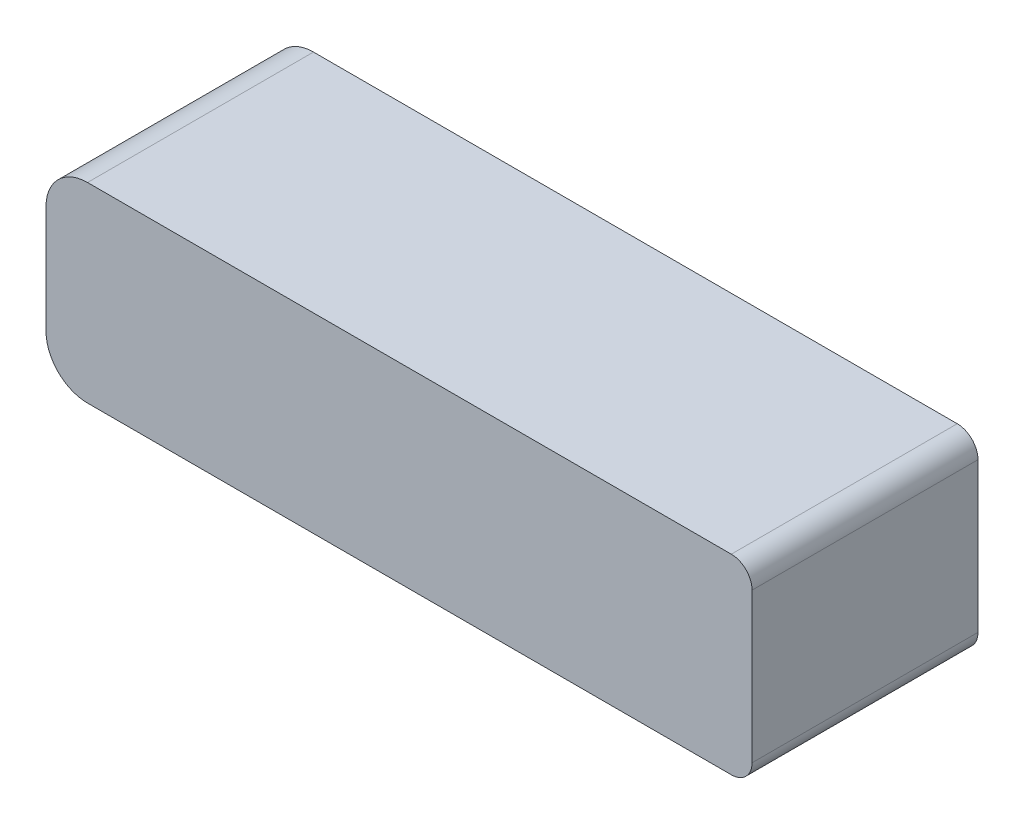
ISO-10303-21;
HEADER;
FILE_DESCRIPTION(('STEP AP214'),'2;1');
FILE_NAME('part.step','',(''),(''),'','','');
FILE_SCHEMA(('AUTOMOTIVE_DESIGN { 1 0 10303 214 1 1 1 1 }'));
ENDSEC;
DATA;
#1=APPLICATION_CONTEXT('core data for automotive mechanical design processes');
#2=APPLICATION_PROTOCOL_DEFINITION('international standard','automotive_design',2000,#1);
#3=PRODUCT_CONTEXT('',#1,'mechanical');
#4=PRODUCT('Part','Part','',(#3));
#5=PRODUCT_RELATED_PRODUCT_CATEGORY('part','',(#4));
#6=PRODUCT_DEFINITION_FORMATION('','',#4);
#7=PRODUCT_DEFINITION_CONTEXT('part definition',#1,'design');
#8=PRODUCT_DEFINITION('design','',#6,#7);
#9=PRODUCT_DEFINITION_SHAPE('','',#8);
#10=(LENGTH_UNIT() NAMED_UNIT(*) SI_UNIT(.MILLI.,.METRE.));
#11=(NAMED_UNIT(*) PLANE_ANGLE_UNIT() SI_UNIT($,.RADIAN.));
#12=(NAMED_UNIT(*) SI_UNIT($,.STERADIAN.) SOLID_ANGLE_UNIT());
#13=UNCERTAINTY_MEASURE_WITH_UNIT(LENGTH_MEASURE(1.E-05),#10,'distance_accuracy_value','');
#14=(GEOMETRIC_REPRESENTATION_CONTEXT(3) GLOBAL_UNCERTAINTY_ASSIGNED_CONTEXT((#13)) GLOBAL_UNIT_ASSIGNED_CONTEXT((#10,
#11,#12)) REPRESENTATION_CONTEXT('',''));
#15=CARTESIAN_POINT('',(0.,0.,0.));
#16=DIRECTION('',(0.,0.,1.));
#17=DIRECTION('',(1.,0.,0.));
#18=AXIS2_PLACEMENT_3D('',#15,#16,#17);
#19=CARTESIAN_POINT('',(-53.975,-14.605,17.272));
#20=DIRECTION('',(-1.,0.,0.));
#21=DIRECTION('',(0.,0.,1.));
#22=AXIS2_PLACEMENT_3D('',#19,#20,#21);
#23=PLANE('',#22);
#24=DIRECTION('',(0.,1.,0.));
#25=VECTOR('',#24,1.);
#26=CARTESIAN_POINT('',(-53.975,-14.605,-17.272));
#27=LINE('',#26,#25);
#28=CARTESIAN_POINT('',(-53.975,-8.255,-17.272));
#29=VERTEX_POINT('',#28);
#30=CARTESIAN_POINT('',(-53.975,8.25499999999999,-17.272));
#31=VERTEX_POINT('',#30);
#32=EDGE_CURVE('E124',#29,#31,#27,.T.);
#33=ORIENTED_EDGE('',*,*,#32,.F.);
#34=DIRECTION('',(0.,0.,1.));
#35=VECTOR('',#34,1.);
#36=CARTESIAN_POINT('',(-53.975,-8.255,17.272));
#37=LINE('',#36,#35);
#38=CARTESIAN_POINT('',(-53.975,-8.255,17.272));
#39=VERTEX_POINT('',#38);
#40=EDGE_CURVE('E147',#29,#39,#37,.T.);
#41=ORIENTED_EDGE('',*,*,#40,.T.);
#42=DIRECTION('',(0.,1.,0.));
#43=VECTOR('',#42,1.);
#44=CARTESIAN_POINT('',(-53.975,-14.605,17.272));
#45=LINE('',#44,#43);
#46=CARTESIAN_POINT('',(-53.975,8.25499999999999,17.272));
#47=VERTEX_POINT('',#46);
#48=EDGE_CURVE('E127',#39,#47,#45,.T.);
#49=ORIENTED_EDGE('',*,*,#48,.T.);
#50=DIRECTION('',(0.,0.,1.));
#51=VECTOR('',#50,1.);
#52=CARTESIAN_POINT('',(-53.975,8.255,-17.272));
#53=LINE('',#52,#51);
#54=EDGE_CURVE('E145',#47,#31,#53,.F.);
#55=ORIENTED_EDGE('',*,*,#54,.T.);
#56=EDGE_LOOP('',(#33,#41,#49,#55));
#57=FACE_BOUND('',#56,.T.);
#58=ADVANCED_FACE('F34',(#57),#23,.T.);
#59=CARTESIAN_POINT('',(-53.975,-14.605,-17.272));
#60=DIRECTION('',(0.,0.,-1.));
#61=DIRECTION('',(-1.,0.,0.));
#62=AXIS2_PLACEMENT_3D('',#59,#60,#61);
#63=PLANE('',#62);
#64=DIRECTION('',(-1.,0.,0.));
#65=VECTOR('',#64,1.);
#66=CARTESIAN_POINT('',(-53.975,-14.605,-17.272));
#67=LINE('',#66,#65);
#68=CARTESIAN_POINT('',(50.8,-14.605,-17.272));
#69=VERTEX_POINT('',#68);
#70=CARTESIAN_POINT('',(-47.625,-14.605,-17.272));
#71=VERTEX_POINT('',#70);
#72=EDGE_CURVE('E133',#69,#71,#67,.T.);
#73=ORIENTED_EDGE('',*,*,#72,.T.);
#74=CARTESIAN_POINT('',(-47.625,-8.255,-17.272));
#75=DIRECTION('',(0.,0.,-1.));
#76=DIRECTION('',(-1.,0.,0.));
#77=AXIS2_PLACEMENT_3D('',#74,#75,#76);
#78=CIRCLE('',#77,6.35);
#79=EDGE_CURVE('E42',#71,#29,#78,.T.);
#80=ORIENTED_EDGE('',*,*,#79,.T.);
#81=ORIENTED_EDGE('',*,*,#32,.T.);
#82=CARTESIAN_POINT('',(-47.625,8.255,-17.272));
#83=DIRECTION('',(0.,0.,-1.));
#84=DIRECTION('',(-1.,0.,0.));
#85=AXIS2_PLACEMENT_3D('',#82,#83,#84);
#86=CIRCLE('',#85,6.35);
#87=CARTESIAN_POINT('',(-47.625,14.605,-17.272));
#88=VERTEX_POINT('',#87);
#89=EDGE_CURVE('E49',#31,#88,#86,.T.);
#90=ORIENTED_EDGE('',*,*,#89,.T.);
#91=DIRECTION('',(-1.,0.,0.));
#92=VECTOR('',#91,1.);
#93=CARTESIAN_POINT('',(-53.975,14.605,-17.272));
#94=LINE('',#93,#92);
#95=CARTESIAN_POINT('',(50.8,14.605,-17.272));
#96=VERTEX_POINT('',#95);
#97=EDGE_CURVE('E167',#96,#88,#94,.T.);
#98=ORIENTED_EDGE('',*,*,#97,.F.);
#99=CARTESIAN_POINT('',(50.8,11.43,-17.272));
#100=DIRECTION('',(0.,0.,-1.));
#101=DIRECTION('',(-1.,0.,0.));
#102=AXIS2_PLACEMENT_3D('',#99,#100,#101);
#103=CIRCLE('',#102,3.175);
#104=CARTESIAN_POINT('',(53.975,11.43,-17.272));
#105=VERTEX_POINT('',#104);
#106=EDGE_CURVE('E111',#96,#105,#103,.T.);
#107=ORIENTED_EDGE('',*,*,#106,.T.);
#108=DIRECTION('',(0.,1.,0.));
#109=VECTOR('',#108,1.);
#110=CARTESIAN_POINT('',(53.975,-14.605,-17.272));
#111=LINE('',#110,#109);
#112=CARTESIAN_POINT('',(53.975,-11.43,-17.272));
#113=VERTEX_POINT('',#112);
#114=EDGE_CURVE('E117',#113,#105,#111,.T.);
#115=ORIENTED_EDGE('',*,*,#114,.F.);
#116=CARTESIAN_POINT('',(50.8,-11.43,-17.272));
#117=DIRECTION('',(0.,0.,-1.));
#118=DIRECTION('',(-1.,0.,0.));
#119=AXIS2_PLACEMENT_3D('',#116,#117,#118);
#120=CIRCLE('',#119,3.175);
#121=EDGE_CURVE('E103',#113,#69,#120,.T.);
#122=ORIENTED_EDGE('',*,*,#121,.T.);
#123=EDGE_LOOP('',(#73,#80,#81,#90,#98,#107,#115,#122));
#124=FACE_BOUND('',#123,.T.);
#125=ADVANCED_FACE('F123',(#124),#63,.T.);
#126=CARTESIAN_POINT('',(53.975,-14.605,-17.272));
#127=DIRECTION('',(1.,0.,0.));
#128=DIRECTION('',(0.,0.,-1.));
#129=AXIS2_PLACEMENT_3D('',#126,#127,#128);
#130=PLANE('',#129);
#131=DIRECTION('',(0.,1.,0.));
#132=VECTOR('',#131,1.);
#133=CARTESIAN_POINT('',(53.975,-14.605,17.272));
#134=LINE('',#133,#132);
#135=CARTESIAN_POINT('',(53.975,-11.43,17.272));
#136=VERTEX_POINT('',#135);
#137=CARTESIAN_POINT('',(53.975,11.43,17.272));
#138=VERTEX_POINT('',#137);
#139=EDGE_CURVE('E120',#136,#138,#134,.T.);
#140=ORIENTED_EDGE('',*,*,#139,.F.);
#141=DIRECTION('',(0.,0.,-1.));
#142=VECTOR('',#141,1.);
#143=CARTESIAN_POINT('',(53.975,-11.43,-17.272));
#144=LINE('',#143,#142);
#145=EDGE_CURVE('E107',#136,#113,#144,.T.);
#146=ORIENTED_EDGE('',*,*,#145,.T.);
#147=ORIENTED_EDGE('',*,*,#114,.T.);
#148=DIRECTION('',(0.,0.,-1.));
#149=VECTOR('',#148,1.);
#150=CARTESIAN_POINT('',(53.975,11.43,17.272));
#151=LINE('',#150,#149);
#152=EDGE_CURVE('E121',#105,#138,#151,.F.);
#153=ORIENTED_EDGE('',*,*,#152,.T.);
#154=EDGE_LOOP('',(#140,#146,#147,#153));
#155=FACE_BOUND('',#154,.T.);
#156=ADVANCED_FACE('F116',(#155),#130,.T.);
#157=CARTESIAN_POINT('',(53.975,-14.605,17.272));
#158=DIRECTION('',(0.,0.,1.));
#159=DIRECTION('',(1.,0.,0.));
#160=AXIS2_PLACEMENT_3D('',#157,#158,#159);
#161=PLANE('',#160);
#162=ORIENTED_EDGE('',*,*,#48,.F.);
#163=CARTESIAN_POINT('',(-47.625,-8.255,17.272));
#164=DIRECTION('',(0.,0.,1.));
#165=DIRECTION('',(1.,0.,0.));
#166=AXIS2_PLACEMENT_3D('',#163,#164,#165);
#167=CIRCLE('',#166,6.35);
#168=CARTESIAN_POINT('',(-47.625,-14.605,17.272));
#169=VERTEX_POINT('',#168);
#170=EDGE_CURVE('E152',#39,#169,#167,.T.);
#171=ORIENTED_EDGE('',*,*,#170,.T.);
#172=DIRECTION('',(1.,0.,0.));
#173=VECTOR('',#172,1.);
#174=CARTESIAN_POINT('',(53.975,-14.605,17.272));
#175=LINE('',#174,#173);
#176=CARTESIAN_POINT('',(50.8,-14.605,17.272));
#177=VERTEX_POINT('',#176);
#178=EDGE_CURVE('E165',#169,#177,#175,.T.);
#179=ORIENTED_EDGE('',*,*,#178,.T.);
#180=CARTESIAN_POINT('',(50.8,-11.43,17.272));
#181=DIRECTION('',(0.,0.,1.));
#182=DIRECTION('',(1.,0.,0.));
#183=AXIS2_PLACEMENT_3D('',#180,#181,#182);
#184=CIRCLE('',#183,3.175);
#185=EDGE_CURVE('E140',#177,#136,#184,.T.);
#186=ORIENTED_EDGE('',*,*,#185,.T.);
#187=ORIENTED_EDGE('',*,*,#139,.T.);
#188=CARTESIAN_POINT('',(50.8,11.43,17.272));
#189=DIRECTION('',(0.,0.,1.));
#190=DIRECTION('',(1.,0.,0.));
#191=AXIS2_PLACEMENT_3D('',#188,#189,#190);
#192=CIRCLE('',#191,3.175);
#193=CARTESIAN_POINT('',(50.8,14.605,17.272));
#194=VERTEX_POINT('',#193);
#195=EDGE_CURVE('E137',#138,#194,#192,.T.);
#196=ORIENTED_EDGE('',*,*,#195,.T.);
#197=DIRECTION('',(1.,0.,0.));
#198=VECTOR('',#197,1.);
#199=CARTESIAN_POINT('',(53.975,14.605,17.272));
#200=LINE('',#199,#198);
#201=CARTESIAN_POINT('',(-47.625,14.605,17.272));
#202=VERTEX_POINT('',#201);
#203=EDGE_CURVE('E169',#202,#194,#200,.T.);
#204=ORIENTED_EDGE('',*,*,#203,.F.);
#205=CARTESIAN_POINT('',(-47.625,8.255,17.272));
#206=DIRECTION('',(0.,0.,1.));
#207=DIRECTION('',(1.,0.,0.));
#208=AXIS2_PLACEMENT_3D('',#205,#206,#207);
#209=CIRCLE('',#208,6.35);
#210=EDGE_CURVE('E150',#202,#47,#209,.T.);
#211=ORIENTED_EDGE('',*,*,#210,.T.);
#212=EDGE_LOOP('',(#162,#171,#179,#186,#187,#196,#204,#211));
#213=FACE_BOUND('',#212,.T.);
#214=ADVANCED_FACE('F164',(#213),#161,.T.);
#215=CARTESIAN_POINT('',(0.,-14.605,0.));
#216=DIRECTION('',(0.,-1.,0.));
#217=DIRECTION('',(0.,0.,-1.));
#218=AXIS2_PLACEMENT_3D('',#215,#216,#217);
#219=PLANE('',#218);
#220=ORIENTED_EDGE('',*,*,#178,.F.);
#221=DIRECTION('',(0.,0.,1.));
#222=VECTOR('',#221,1.);
#223=CARTESIAN_POINT('',(-47.625,-14.605,0.));
#224=LINE('',#223,#222);
#225=EDGE_CURVE('E57',#169,#71,#224,.F.);
#226=ORIENTED_EDGE('',*,*,#225,.T.);
#227=ORIENTED_EDGE('',*,*,#72,.F.);
#228=DIRECTION('',(0.,0.,-1.));
#229=VECTOR('',#228,1.);
#230=CARTESIAN_POINT('',(50.8,-14.605,0.));
#231=LINE('',#230,#229);
#232=EDGE_CURVE('E109',#69,#177,#231,.F.);
#233=ORIENTED_EDGE('',*,*,#232,.T.);
#234=EDGE_LOOP('',(#220,#226,#227,#233));
#235=FACE_BOUND('',#234,.T.);
#236=ADVANCED_FACE('F166',(#235),#219,.T.);
#237=CARTESIAN_POINT('',(0.,14.605,0.));
#238=DIRECTION('',(0.,-1.,0.));
#239=DIRECTION('',(0.,0.,-1.));
#240=AXIS2_PLACEMENT_3D('',#237,#238,#239);
#241=PLANE('',#240);
#242=ORIENTED_EDGE('',*,*,#97,.T.);
#243=DIRECTION('',(0.,0.,1.));
#244=VECTOR('',#243,1.);
#245=CARTESIAN_POINT('',(-47.625,14.605,17.272));
#246=LINE('',#245,#244);
#247=EDGE_CURVE('E11',#88,#202,#246,.T.);
#248=ORIENTED_EDGE('',*,*,#247,.T.);
#249=ORIENTED_EDGE('',*,*,#203,.T.);
#250=DIRECTION('',(0.,0.,-1.));
#251=VECTOR('',#250,1.);
#252=CARTESIAN_POINT('',(50.8,14.605,-17.272));
#253=LINE('',#252,#251);
#254=EDGE_CURVE('E142',#194,#96,#253,.T.);
#255=ORIENTED_EDGE('',*,*,#254,.T.);
#256=EDGE_LOOP('',(#242,#248,#249,#255));
#257=FACE_BOUND('',#256,.T.);
#258=ADVANCED_FACE('F174',(#257),#241,.F.);
#259=CARTESIAN_POINT('',(50.8,-11.43,-17.272));
#260=DIRECTION('',(0.,0.,-1.));
#261=DIRECTION('',(-1.,0.,0.));
#262=AXIS2_PLACEMENT_3D('',#259,#260,#261);
#263=CYLINDRICAL_SURFACE('',#262,3.175);
#264=ORIENTED_EDGE('',*,*,#185,.F.);
#265=ORIENTED_EDGE('',*,*,#232,.F.);
#266=ORIENTED_EDGE('',*,*,#121,.F.);
#267=ORIENTED_EDGE('',*,*,#145,.F.);
#268=EDGE_LOOP('',(#264,#265,#266,#267));
#269=FACE_BOUND('',#268,.T.);
#270=ADVANCED_FACE('F106',(#269),#263,.T.);
#271=CARTESIAN_POINT('',(50.8,11.43,0.));
#272=DIRECTION('',(0.,0.,1.));
#273=DIRECTION('',(1.,0.,0.));
#274=AXIS2_PLACEMENT_3D('',#271,#272,#273);
#275=CYLINDRICAL_SURFACE('',#274,3.175);
#276=ORIENTED_EDGE('',*,*,#195,.F.);
#277=ORIENTED_EDGE('',*,*,#152,.F.);
#278=ORIENTED_EDGE('',*,*,#106,.F.);
#279=ORIENTED_EDGE('',*,*,#254,.F.);
#280=EDGE_LOOP('',(#276,#277,#278,#279));
#281=FACE_BOUND('',#280,.T.);
#282=ADVANCED_FACE('F179',(#281),#275,.T.);
#283=CARTESIAN_POINT('',(-47.625,-8.255,17.272));
#284=DIRECTION('',(0.,0.,1.));
#285=DIRECTION('',(1.,0.,0.));
#286=AXIS2_PLACEMENT_3D('',#283,#284,#285);
#287=CYLINDRICAL_SURFACE('',#286,6.35);
#288=ORIENTED_EDGE('',*,*,#79,.F.);
#289=ORIENTED_EDGE('',*,*,#225,.F.);
#290=ORIENTED_EDGE('',*,*,#170,.F.);
#291=ORIENTED_EDGE('',*,*,#40,.F.);
#292=EDGE_LOOP('',(#288,#289,#290,#291));
#293=FACE_BOUND('',#292,.T.);
#294=ADVANCED_FACE('F162',(#293),#287,.T.);
#295=CARTESIAN_POINT('',(-47.625,8.255,0.));
#296=DIRECTION('',(0.,0.,-1.));
#297=DIRECTION('',(-1.,0.,0.));
#298=AXIS2_PLACEMENT_3D('',#295,#296,#297);
#299=CYLINDRICAL_SURFACE('',#298,6.35);
#300=ORIENTED_EDGE('',*,*,#89,.F.);
#301=ORIENTED_EDGE('',*,*,#54,.F.);
#302=ORIENTED_EDGE('',*,*,#210,.F.);
#303=ORIENTED_EDGE('',*,*,#247,.F.);
#304=EDGE_LOOP('',(#300,#301,#302,#303));
#305=FACE_BOUND('',#304,.T.);
#306=ADVANCED_FACE('F36',(#305),#299,.T.);
#307=CLOSED_SHELL('',(#58,#125,#156,#214,#236,#258,#270,#282,#294,#306));
#308=MANIFOLD_SOLID_BREP('B2',#307);
#309=ADVANCED_BREP_SHAPE_REPRESENTATION('',(#18,#308),#14);
#310=SHAPE_DEFINITION_REPRESENTATION(#9,#309);
ENDSEC;
END-ISO-10303-21;
